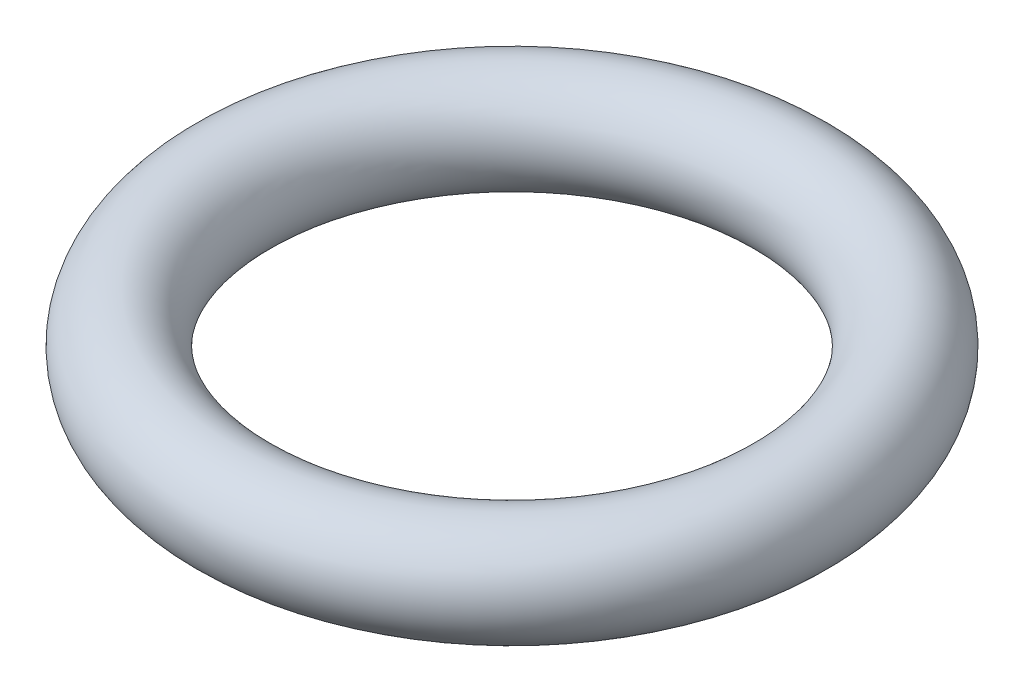
ISO-10303-21;
HEADER;
FILE_DESCRIPTION(('STEP AP214'),'2;1');
FILE_NAME('part.step','',(''),(''),'','','');
FILE_SCHEMA(('AUTOMOTIVE_DESIGN { 1 0 10303 214 1 1 1 1 }'));
ENDSEC;
DATA;
#1=APPLICATION_CONTEXT('core data for automotive mechanical design processes');
#2=APPLICATION_PROTOCOL_DEFINITION('international standard','automotive_design',2000,#1);
#3=PRODUCT_CONTEXT('',#1,'mechanical');
#4=PRODUCT('Part','Part','',(#3));
#5=PRODUCT_RELATED_PRODUCT_CATEGORY('part','',(#4));
#6=PRODUCT_DEFINITION_FORMATION('','',#4);
#7=PRODUCT_DEFINITION_CONTEXT('part definition',#1,'design');
#8=PRODUCT_DEFINITION('design','',#6,#7);
#9=PRODUCT_DEFINITION_SHAPE('','',#8);
#10=(LENGTH_UNIT() NAMED_UNIT(*) SI_UNIT(.MILLI.,.METRE.));
#11=(NAMED_UNIT(*) PLANE_ANGLE_UNIT() SI_UNIT($,.RADIAN.));
#12=(NAMED_UNIT(*) SI_UNIT($,.STERADIAN.) SOLID_ANGLE_UNIT());
#13=UNCERTAINTY_MEASURE_WITH_UNIT(LENGTH_MEASURE(1.E-05),#10,'distance_accuracy_value','');
#14=(GEOMETRIC_REPRESENTATION_CONTEXT(3) GLOBAL_UNCERTAINTY_ASSIGNED_CONTEXT((#13)) GLOBAL_UNIT_ASSIGNED_CONTEXT((#10,
#11,#12)) REPRESENTATION_CONTEXT('',''));
#15=CARTESIAN_POINT('',(0.,0.,0.));
#16=DIRECTION('',(0.,0.,1.));
#17=DIRECTION('',(1.,0.,0.));
#18=AXIS2_PLACEMENT_3D('',#15,#16,#17);
#19=CARTESIAN_POINT('',(0.,0.,0.));
#20=DIRECTION('',(0.,-1.,0.));
#21=DIRECTION('',(0.,0.,-1.));
#22=AXIS2_PLACEMENT_3D('',#19,#20,#21);
#23=TOROIDAL_SURFACE('',#22,6.75,1.25);
#24=CARTESIAN_POINT('',(0.,0.,-8.));
#25=VERTEX_POINT('',#24);
#26=VERTEX_LOOP('',#25);
#27=FACE_BOUND('',#26,.T.);
#28=ADVANCED_FACE('F30',(#27),#23,.T.);
#29=CLOSED_SHELL('',(#28));
#30=MANIFOLD_SOLID_BREP('B2',#29);
#31=ADVANCED_BREP_SHAPE_REPRESENTATION('',(#18,#30),#14);
#32=SHAPE_DEFINITION_REPRESENTATION(#9,#31);
ENDSEC;
END-ISO-10303-21;
